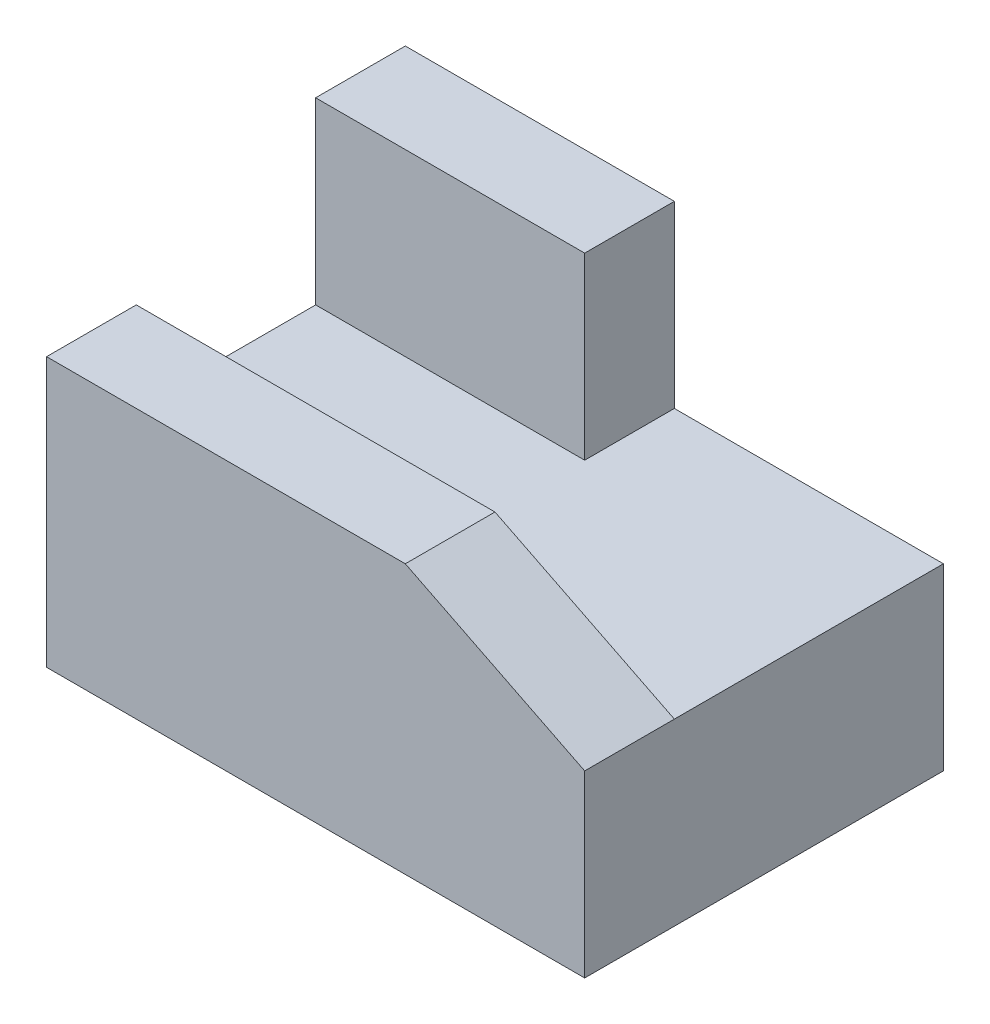
ISO-10303-21;
HEADER;
FILE_DESCRIPTION(('STEP AP214'),'2;1');
FILE_NAME('part.step','',(''),(''),'','','');
FILE_SCHEMA(('AUTOMOTIVE_DESIGN { 1 0 10303 214 1 1 1 1 }'));
ENDSEC;
DATA;
#1=APPLICATION_CONTEXT('core data for automotive mechanical design processes');
#2=APPLICATION_PROTOCOL_DEFINITION('international standard','automotive_design',2000,#1);
#3=PRODUCT_CONTEXT('',#1,'mechanical');
#4=PRODUCT('Part','Part','',(#3));
#5=PRODUCT_RELATED_PRODUCT_CATEGORY('part','',(#4));
#6=PRODUCT_DEFINITION_FORMATION('','',#4);
#7=PRODUCT_DEFINITION_CONTEXT('part definition',#1,'design');
#8=PRODUCT_DEFINITION('design','',#6,#7);
#9=PRODUCT_DEFINITION_SHAPE('','',#8);
#10=(LENGTH_UNIT() NAMED_UNIT(*) SI_UNIT(.MILLI.,.METRE.));
#11=(NAMED_UNIT(*) PLANE_ANGLE_UNIT() SI_UNIT($,.RADIAN.));
#12=(NAMED_UNIT(*) SI_UNIT($,.STERADIAN.) SOLID_ANGLE_UNIT());
#13=UNCERTAINTY_MEASURE_WITH_UNIT(LENGTH_MEASURE(1.E-05),#10,'distance_accuracy_value','');
#14=(GEOMETRIC_REPRESENTATION_CONTEXT(3) GLOBAL_UNCERTAINTY_ASSIGNED_CONTEXT((#13)) GLOBAL_UNIT_ASSIGNED_CONTEXT((#10,
#11,#12)) REPRESENTATION_CONTEXT('',''));
#15=CARTESIAN_POINT('',(0.,0.,0.));
#16=DIRECTION('',(0.,0.,1.));
#17=DIRECTION('',(1.,0.,0.));
#18=AXIS2_PLACEMENT_3D('',#15,#16,#17);
#19=CARTESIAN_POINT('',(0.,10.,0.));
#20=DIRECTION('',(1.,0.,0.));
#21=DIRECTION('',(0.,0.,-1.));
#22=AXIS2_PLACEMENT_3D('',#19,#20,#21);
#23=PLANE('',#22);
#24=DIRECTION('',(0.,0.,1.));
#25=VECTOR('',#24,1.);
#26=CARTESIAN_POINT('',(0.,0.,0.));
#27=LINE('',#26,#25);
#28=CARTESIAN_POINT('',(0.,0.,-20.));
#29=VERTEX_POINT('',#28);
#30=CARTESIAN_POINT('',(0.,0.,0.));
#31=VERTEX_POINT('',#30);
#32=EDGE_CURVE('E160',#29,#31,#27,.T.);
#33=ORIENTED_EDGE('',*,*,#32,.T.);
#34=DIRECTION('',(0.,-1.,0.));
#35=VECTOR('',#34,1.);
#36=CARTESIAN_POINT('',(0.,10.,0.));
#37=LINE('',#36,#35);
#38=CARTESIAN_POINT('',(0.,15.,0.));
#39=VERTEX_POINT('',#38);
#40=EDGE_CURVE('E11',#39,#31,#37,.T.);
#41=ORIENTED_EDGE('',*,*,#40,.F.);
#42=DIRECTION('',(0.,0.,1.));
#43=VECTOR('',#42,1.);
#44=CARTESIAN_POINT('',(0.,15.,-5.));
#45=LINE('',#44,#43);
#46=CARTESIAN_POINT('',(0.,15.,-5.));
#47=VERTEX_POINT('',#46);
#48=EDGE_CURVE('E157',#47,#39,#45,.T.);
#49=ORIENTED_EDGE('',*,*,#48,.F.);
#50=DIRECTION('',(0.,-1.,0.));
#51=VECTOR('',#50,1.);
#52=CARTESIAN_POINT('',(0.,10.,-5.));
#53=LINE('',#52,#51);
#54=CARTESIAN_POINT('',(0.,10.,-5.));
#55=VERTEX_POINT('',#54);
#56=EDGE_CURVE('E150',#47,#55,#53,.T.);
#57=ORIENTED_EDGE('',*,*,#56,.T.);
#58=DIRECTION('',(0.,0.,1.));
#59=VECTOR('',#58,1.);
#60=CARTESIAN_POINT('',(0.,10.,0.));
#61=LINE('',#60,#59);
#62=CARTESIAN_POINT('',(0.,10.,-15.));
#63=VERTEX_POINT('',#62);
#64=EDGE_CURVE('E128',#63,#55,#61,.T.);
#65=ORIENTED_EDGE('',*,*,#64,.F.);
#66=DIRECTION('',(0.,1.,0.));
#67=VECTOR('',#66,1.);
#68=CARTESIAN_POINT('',(0.,10.,-15.));
#69=LINE('',#68,#67);
#70=CARTESIAN_POINT('',(0.,20.,-15.));
#71=VERTEX_POINT('',#70);
#72=EDGE_CURVE('E122',#63,#71,#69,.T.);
#73=ORIENTED_EDGE('',*,*,#72,.T.);
#74=DIRECTION('',(0.,0.,-1.));
#75=VECTOR('',#74,1.);
#76=CARTESIAN_POINT('',(0.,20.,-15.));
#77=LINE('',#76,#75);
#78=CARTESIAN_POINT('',(0.,20.,-20.));
#79=VERTEX_POINT('',#78);
#80=EDGE_CURVE('E105',#71,#79,#77,.T.);
#81=ORIENTED_EDGE('',*,*,#80,.T.);
#82=DIRECTION('',(0.,-1.,0.));
#83=VECTOR('',#82,1.);
#84=CARTESIAN_POINT('',(0.,10.,-20.));
#85=LINE('',#84,#83);
#86=EDGE_CURVE('E169',#79,#29,#85,.T.);
#87=ORIENTED_EDGE('',*,*,#86,.T.);
#88=EDGE_LOOP('',(#33,#41,#49,#57,#65,#73,#81,#87));
#89=FACE_BOUND('',#88,.T.);
#90=ADVANCED_FACE('F33',(#89),#23,.F.);
#91=CARTESIAN_POINT('',(0.,10.,0.));
#92=DIRECTION('',(0.,0.,-1.));
#93=DIRECTION('',(-1.,0.,0.));
#94=AXIS2_PLACEMENT_3D('',#91,#92,#93);
#95=PLANE('',#94);
#96=DIRECTION('',(1.,0.,0.));
#97=VECTOR('',#96,1.);
#98=CARTESIAN_POINT('',(0.,0.,0.));
#99=LINE('',#98,#97);
#100=CARTESIAN_POINT('',(30.,0.,0.));
#101=VERTEX_POINT('',#100);
#102=EDGE_CURVE('E171',#31,#101,#99,.T.);
#103=ORIENTED_EDGE('',*,*,#102,.T.);
#104=DIRECTION('',(0.,-1.,0.));
#105=VECTOR('',#104,1.);
#106=CARTESIAN_POINT('',(30.,10.,0.));
#107=LINE('',#106,#105);
#108=CARTESIAN_POINT('',(30.,10.,0.));
#109=VERTEX_POINT('',#108);
#110=EDGE_CURVE('E40',#109,#101,#107,.T.);
#111=ORIENTED_EDGE('',*,*,#110,.F.);
#112=DIRECTION('',(-0.894427190999916,0.447213595499958,0.));
#113=VECTOR('',#112,1.);
#114=CARTESIAN_POINT('',(20.,15.,0.));
#115=LINE('',#114,#113);
#116=CARTESIAN_POINT('',(20.,15.,0.));
#117=VERTEX_POINT('',#116);
#118=EDGE_CURVE('E138',#109,#117,#115,.T.);
#119=ORIENTED_EDGE('',*,*,#118,.T.);
#120=DIRECTION('',(-1.,0.,0.));
#121=VECTOR('',#120,1.);
#122=CARTESIAN_POINT('',(0.,15.,0.));
#123=LINE('',#122,#121);
#124=EDGE_CURVE('E144',#117,#39,#123,.T.);
#125=ORIENTED_EDGE('',*,*,#124,.T.);
#126=ORIENTED_EDGE('',*,*,#40,.T.);
#127=EDGE_LOOP('',(#103,#111,#119,#125,#126));
#128=FACE_BOUND('',#127,.T.);
#129=ADVANCED_FACE('F199',(#128),#95,.F.);
#130=CARTESIAN_POINT('',(30.,10.,0.));
#131=DIRECTION('',(-1.,0.,0.));
#132=DIRECTION('',(0.,0.,1.));
#133=AXIS2_PLACEMENT_3D('',#130,#131,#132);
#134=PLANE('',#133);
#135=DIRECTION('',(0.,0.,-1.));
#136=VECTOR('',#135,1.);
#137=CARTESIAN_POINT('',(30.,0.,0.));
#138=LINE('',#137,#136);
#139=CARTESIAN_POINT('',(30.,0.,-20.));
#140=VERTEX_POINT('',#139);
#141=EDGE_CURVE('E173',#101,#140,#138,.T.);
#142=ORIENTED_EDGE('',*,*,#141,.T.);
#143=DIRECTION('',(0.,-1.,0.));
#144=VECTOR('',#143,1.);
#145=CARTESIAN_POINT('',(30.,10.,-20.));
#146=LINE('',#145,#144);
#147=CARTESIAN_POINT('',(30.,10.,-20.));
#148=VERTEX_POINT('',#147);
#149=EDGE_CURVE('E177',#148,#140,#146,.T.);
#150=ORIENTED_EDGE('',*,*,#149,.F.);
#151=DIRECTION('',(0.,0.,-1.));
#152=VECTOR('',#151,1.);
#153=CARTESIAN_POINT('',(30.,10.,0.));
#154=LINE('',#153,#152);
#155=CARTESIAN_POINT('',(30.,10.,-5.));
#156=VERTEX_POINT('',#155);
#157=EDGE_CURVE('E163',#156,#148,#154,.T.);
#158=ORIENTED_EDGE('',*,*,#157,.F.);
#159=EDGE_CURVE('E165',#109,#156,#154,.T.);
#160=ORIENTED_EDGE('',*,*,#159,.F.);
#161=ORIENTED_EDGE('',*,*,#110,.T.);
#162=EDGE_LOOP('',(#142,#150,#158,#160,#161));
#163=FACE_BOUND('',#162,.T.);
#164=ADVANCED_FACE('F184',(#163),#134,.F.);
#165=CARTESIAN_POINT('',(0.,10.,-20.));
#166=DIRECTION('',(0.,0.,1.));
#167=DIRECTION('',(1.,0.,0.));
#168=AXIS2_PLACEMENT_3D('',#165,#166,#167);
#169=PLANE('',#168);
#170=DIRECTION('',(-1.,0.,0.));
#171=VECTOR('',#170,1.);
#172=CARTESIAN_POINT('',(0.,0.,-20.));
#173=LINE('',#172,#171);
#174=EDGE_CURVE('E164',#140,#29,#173,.T.);
#175=ORIENTED_EDGE('',*,*,#174,.T.);
#176=ORIENTED_EDGE('',*,*,#86,.F.);
#177=DIRECTION('',(1.,0.,0.));
#178=VECTOR('',#177,1.);
#179=CARTESIAN_POINT('',(0.,20.,-20.));
#180=LINE('',#179,#178);
#181=CARTESIAN_POINT('',(15.,20.,-20.));
#182=VERTEX_POINT('',#181);
#183=EDGE_CURVE('E110',#79,#182,#180,.T.);
#184=ORIENTED_EDGE('',*,*,#183,.T.);
#185=DIRECTION('',(0.,-1.,0.));
#186=VECTOR('',#185,1.);
#187=CARTESIAN_POINT('',(15.,10.,-20.));
#188=LINE('',#187,#186);
#189=CARTESIAN_POINT('',(15.,10.,-20.));
#190=VERTEX_POINT('',#189);
#191=EDGE_CURVE('E129',#182,#190,#188,.T.);
#192=ORIENTED_EDGE('',*,*,#191,.T.);
#193=DIRECTION('',(-1.,0.,0.));
#194=VECTOR('',#193,1.);
#195=CARTESIAN_POINT('',(0.,10.,-20.));
#196=LINE('',#195,#194);
#197=EDGE_CURVE('E52',#148,#190,#196,.T.);
#198=ORIENTED_EDGE('',*,*,#197,.F.);
#199=ORIENTED_EDGE('',*,*,#149,.T.);
#200=EDGE_LOOP('',(#175,#176,#184,#192,#198,#199));
#201=FACE_BOUND('',#200,.T.);
#202=ADVANCED_FACE('F193',(#201),#169,.F.);
#203=CARTESIAN_POINT('',(0.,10.,0.));
#204=DIRECTION('',(0.,-1.,0.));
#205=DIRECTION('',(0.,0.,-1.));
#206=AXIS2_PLACEMENT_3D('',#203,#204,#205);
#207=PLANE('',#206);
#208=ORIENTED_EDGE('',*,*,#197,.T.);
#209=DIRECTION('',(0.,0.,-1.));
#210=VECTOR('',#209,1.);
#211=CARTESIAN_POINT('',(15.,10.,-15.));
#212=LINE('',#211,#210);
#213=CARTESIAN_POINT('',(15.,10.,-15.));
#214=VERTEX_POINT('',#213);
#215=EDGE_CURVE('E47',#214,#190,#212,.T.);
#216=ORIENTED_EDGE('',*,*,#215,.F.);
#217=DIRECTION('',(-1.,0.,0.));
#218=VECTOR('',#217,1.);
#219=CARTESIAN_POINT('',(0.,10.,-15.));
#220=LINE('',#219,#218);
#221=EDGE_CURVE('E115',#214,#63,#220,.T.);
#222=ORIENTED_EDGE('',*,*,#221,.T.);
#223=ORIENTED_EDGE('',*,*,#64,.T.);
#224=DIRECTION('',(1.,0.,0.));
#225=VECTOR('',#224,1.);
#226=CARTESIAN_POINT('',(30.,10.,-5.));
#227=LINE('',#226,#225);
#228=EDGE_CURVE('E140',#55,#156,#227,.T.);
#229=ORIENTED_EDGE('',*,*,#228,.T.);
#230=ORIENTED_EDGE('',*,*,#157,.T.);
#231=EDGE_LOOP('',(#208,#216,#222,#223,#229,#230));
#232=FACE_BOUND('',#231,.T.);
#233=ADVANCED_FACE('F205',(#232),#207,.F.);
#234=CARTESIAN_POINT('',(0.,0.,0.));
#235=DIRECTION('',(0.,-1.,0.));
#236=DIRECTION('',(0.,0.,-1.));
#237=AXIS2_PLACEMENT_3D('',#234,#235,#236);
#238=PLANE('',#237);
#239=ORIENTED_EDGE('',*,*,#32,.F.);
#240=ORIENTED_EDGE('',*,*,#174,.F.);
#241=ORIENTED_EDGE('',*,*,#141,.F.);
#242=ORIENTED_EDGE('',*,*,#102,.F.);
#243=EDGE_LOOP('',(#239,#240,#241,#242));
#244=FACE_BOUND('',#243,.T.);
#245=ADVANCED_FACE('F191',(#244),#238,.T.);
#246=CARTESIAN_POINT('',(0.,15.,-5.));
#247=DIRECTION('',(0.,1.,0.));
#248=DIRECTION('',(0.,0.,1.));
#249=AXIS2_PLACEMENT_3D('',#246,#247,#248);
#250=PLANE('',#249);
#251=ORIENTED_EDGE('',*,*,#124,.F.);
#252=DIRECTION('',(0.,0.,1.));
#253=VECTOR('',#252,1.);
#254=CARTESIAN_POINT('',(20.,15.,-5.));
#255=LINE('',#254,#253);
#256=CARTESIAN_POINT('',(20.,15.,-5.));
#257=VERTEX_POINT('',#256);
#258=EDGE_CURVE('E152',#257,#117,#255,.T.);
#259=ORIENTED_EDGE('',*,*,#258,.F.);
#260=DIRECTION('',(-1.,0.,0.));
#261=VECTOR('',#260,1.);
#262=CARTESIAN_POINT('',(0.,15.,-5.));
#263=LINE('',#262,#261);
#264=EDGE_CURVE('E147',#257,#47,#263,.T.);
#265=ORIENTED_EDGE('',*,*,#264,.T.);
#266=ORIENTED_EDGE('',*,*,#48,.T.);
#267=EDGE_LOOP('',(#251,#259,#265,#266));
#268=FACE_BOUND('',#267,.T.);
#269=ADVANCED_FACE('F196',(#268),#250,.T.);
#270=CARTESIAN_POINT('',(20.,15.,-5.));
#271=DIRECTION('',(0.447213595499958,0.894427190999916,0.));
#272=DIRECTION('',(-0.894427190999916,0.447213595499958,0.));
#273=AXIS2_PLACEMENT_3D('',#270,#271,#272);
#274=PLANE('',#273);
#275=ORIENTED_EDGE('',*,*,#118,.F.);
#276=ORIENTED_EDGE('',*,*,#159,.T.);
#277=DIRECTION('',(-0.894427190999916,0.447213595499958,0.));
#278=VECTOR('',#277,1.);
#279=CARTESIAN_POINT('',(20.,15.,-5.));
#280=LINE('',#279,#278);
#281=EDGE_CURVE('E143',#156,#257,#280,.T.);
#282=ORIENTED_EDGE('',*,*,#281,.T.);
#283=ORIENTED_EDGE('',*,*,#258,.T.);
#284=EDGE_LOOP('',(#275,#276,#282,#283));
#285=FACE_BOUND('',#284,.T.);
#286=ADVANCED_FACE('F201',(#285),#274,.T.);
#287=CARTESIAN_POINT('',(0.,0.,-5.));
#288=DIRECTION('',(0.,0.,-1.));
#289=DIRECTION('',(-1.,0.,0.));
#290=AXIS2_PLACEMENT_3D('',#287,#288,#289);
#291=PLANE('',#290);
#292=ORIENTED_EDGE('',*,*,#228,.F.);
#293=ORIENTED_EDGE('',*,*,#56,.F.);
#294=ORIENTED_EDGE('',*,*,#264,.F.);
#295=ORIENTED_EDGE('',*,*,#281,.F.);
#296=EDGE_LOOP('',(#292,#293,#294,#295));
#297=FACE_BOUND('',#296,.T.);
#298=ADVANCED_FACE('F204',(#297),#291,.T.);
#299=CARTESIAN_POINT('',(15.,10.,-15.));
#300=DIRECTION('',(1.,0.,0.));
#301=DIRECTION('',(0.,0.,-1.));
#302=AXIS2_PLACEMENT_3D('',#299,#300,#301);
#303=PLANE('',#302);
#304=ORIENTED_EDGE('',*,*,#191,.F.);
#305=DIRECTION('',(0.,0.,-1.));
#306=VECTOR('',#305,1.);
#307=CARTESIAN_POINT('',(15.,20.,-15.));
#308=LINE('',#307,#306);
#309=CARTESIAN_POINT('',(15.,20.,-15.));
#310=VERTEX_POINT('',#309);
#311=EDGE_CURVE('E114',#310,#182,#308,.T.);
#312=ORIENTED_EDGE('',*,*,#311,.F.);
#313=DIRECTION('',(0.,-1.,0.));
#314=VECTOR('',#313,1.);
#315=CARTESIAN_POINT('',(15.,10.,-15.));
#316=LINE('',#315,#314);
#317=EDGE_CURVE('E123',#310,#214,#316,.T.);
#318=ORIENTED_EDGE('',*,*,#317,.T.);
#319=ORIENTED_EDGE('',*,*,#215,.T.);
#320=EDGE_LOOP('',(#304,#312,#318,#319));
#321=FACE_BOUND('',#320,.T.);
#322=ADVANCED_FACE('F208',(#321),#303,.T.);
#323=CARTESIAN_POINT('',(0.,20.,-15.));
#324=DIRECTION('',(0.,1.,0.));
#325=DIRECTION('',(-1.,0.,0.));
#326=AXIS2_PLACEMENT_3D('',#323,#324,#325);
#327=PLANE('',#326);
#328=ORIENTED_EDGE('',*,*,#183,.F.);
#329=ORIENTED_EDGE('',*,*,#80,.F.);
#330=DIRECTION('',(1.,0.,0.));
#331=VECTOR('',#330,1.);
#332=CARTESIAN_POINT('',(0.,20.,-15.));
#333=LINE('',#332,#331);
#334=EDGE_CURVE('E108',#71,#310,#333,.T.);
#335=ORIENTED_EDGE('',*,*,#334,.T.);
#336=ORIENTED_EDGE('',*,*,#311,.T.);
#337=EDGE_LOOP('',(#328,#329,#335,#336));
#338=FACE_BOUND('',#337,.T.);
#339=ADVANCED_FACE('F107',(#338),#327,.T.);
#340=CARTESIAN_POINT('',(0.,0.,-15.));
#341=DIRECTION('',(0.,0.,-1.));
#342=DIRECTION('',(-1.,0.,0.));
#343=AXIS2_PLACEMENT_3D('',#340,#341,#342);
#344=PLANE('',#343);
#345=ORIENTED_EDGE('',*,*,#72,.F.);
#346=ORIENTED_EDGE('',*,*,#221,.F.);
#347=ORIENTED_EDGE('',*,*,#317,.F.);
#348=ORIENTED_EDGE('',*,*,#334,.F.);
#349=EDGE_LOOP('',(#345,#346,#347,#348));
#350=FACE_BOUND('',#349,.T.);
#351=ADVANCED_FACE('F120',(#350),#344,.F.);
#352=CLOSED_SHELL('',(#90,#129,#164,#202,#233,#245,#269,#286,#298,#322,#339,#351));
#353=MANIFOLD_SOLID_BREP('B2',#352);
#354=ADVANCED_BREP_SHAPE_REPRESENTATION('',(#18,#353),#14);
#355=SHAPE_DEFINITION_REPRESENTATION(#9,#354);
ENDSEC;
END-ISO-10303-21;
